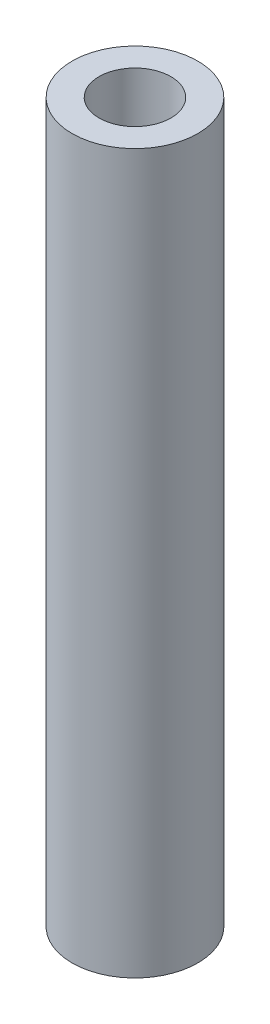
ISO-10303-21;
HEADER;
FILE_DESCRIPTION(('STEP AP214'),'2;1');
FILE_NAME('part.step','',(''),(''),'','','');
FILE_SCHEMA(('AUTOMOTIVE_DESIGN { 1 0 10303 214 1 1 1 1 }'));
ENDSEC;
DATA;
#1=APPLICATION_CONTEXT('core data for automotive mechanical design processes');
#2=APPLICATION_PROTOCOL_DEFINITION('international standard','automotive_design',2000,#1);
#3=PRODUCT_CONTEXT('',#1,'mechanical');
#4=PRODUCT('Part','Part','',(#3));
#5=PRODUCT_RELATED_PRODUCT_CATEGORY('part','',(#4));
#6=PRODUCT_DEFINITION_FORMATION('','',#4);
#7=PRODUCT_DEFINITION_CONTEXT('part definition',#1,'design');
#8=PRODUCT_DEFINITION('design','',#6,#7);
#9=PRODUCT_DEFINITION_SHAPE('','',#8);
#10=(LENGTH_UNIT() NAMED_UNIT(*) SI_UNIT(.MILLI.,.METRE.));
#11=(NAMED_UNIT(*) PLANE_ANGLE_UNIT() SI_UNIT($,.RADIAN.));
#12=(NAMED_UNIT(*) SI_UNIT($,.STERADIAN.) SOLID_ANGLE_UNIT());
#13=UNCERTAINTY_MEASURE_WITH_UNIT(LENGTH_MEASURE(1.E-05),#10,'distance_accuracy_value','');
#14=(GEOMETRIC_REPRESENTATION_CONTEXT(3) GLOBAL_UNCERTAINTY_ASSIGNED_CONTEXT((#13)) GLOBAL_UNIT_ASSIGNED_CONTEXT((#10,
#11,#12)) REPRESENTATION_CONTEXT('',''));
#15=CARTESIAN_POINT('',(0.,0.,0.));
#16=DIRECTION('',(0.,0.,1.));
#17=DIRECTION('',(1.,0.,0.));
#18=AXIS2_PLACEMENT_3D('',#15,#16,#17);
#19=CARTESIAN_POINT('',(0.,40.,0.));
#20=DIRECTION('',(0.,1.,0.));
#21=DIRECTION('',(0.,0.,1.));
#22=AXIS2_PLACEMENT_3D('',#19,#20,#21);
#23=PLANE('',#22);
#24=CARTESIAN_POINT('',(0.,40.,0.));
#25=DIRECTION('',(0.,1.,0.));
#26=DIRECTION('',(0.,0.,1.));
#27=AXIS2_PLACEMENT_3D('',#24,#25,#26);
#28=CIRCLE('',#27,3.5);
#29=CARTESIAN_POINT('',(0.,40.,3.5));
#30=VERTEX_POINT('',#29);
#31=EDGE_CURVE('E10',#30,#30,#28,.T.);
#32=ORIENTED_EDGE('',*,*,#31,.T.);
#33=EDGE_LOOP('',(#32));
#34=FACE_BOUND('',#33,.T.);
#35=CARTESIAN_POINT('',(0.,40.,0.));
#36=DIRECTION('',(0.,1.,0.));
#37=DIRECTION('',(0.,0.,1.));
#38=AXIS2_PLACEMENT_3D('',#35,#36,#37);
#39=CIRCLE('',#38,2.);
#40=CARTESIAN_POINT('',(0.,40.,2.));
#41=VERTEX_POINT('',#40);
#42=EDGE_CURVE('E50',#41,#41,#39,.T.);
#43=ORIENTED_EDGE('',*,*,#42,.F.);
#44=EDGE_LOOP('',(#43));
#45=FACE_BOUND('',#44,.T.);
#46=ADVANCED_FACE('F37',(#34,#45),#23,.T.);
#47=CARTESIAN_POINT('',(0.,0.,0.));
#48=DIRECTION('',(0.,1.,0.));
#49=DIRECTION('',(0.,0.,1.));
#50=AXIS2_PLACEMENT_3D('',#47,#48,#49);
#51=PLANE('',#50);
#52=CARTESIAN_POINT('',(0.,0.,0.));
#53=DIRECTION('',(0.,1.,0.));
#54=DIRECTION('',(0.,0.,1.));
#55=AXIS2_PLACEMENT_3D('',#52,#53,#54);
#56=CIRCLE('',#55,3.5);
#57=CARTESIAN_POINT('',(0.,0.,3.5));
#58=VERTEX_POINT('',#57);
#59=EDGE_CURVE('E41',#58,#58,#56,.T.);
#60=ORIENTED_EDGE('',*,*,#59,.F.);
#61=EDGE_LOOP('',(#60));
#62=FACE_BOUND('',#61,.T.);
#63=CARTESIAN_POINT('',(0.,0.,0.));
#64=DIRECTION('',(0.,1.,0.));
#65=DIRECTION('',(0.,0.,1.));
#66=AXIS2_PLACEMENT_3D('',#63,#64,#65);
#67=CIRCLE('',#66,2.);
#68=CARTESIAN_POINT('',(0.,0.,2.));
#69=VERTEX_POINT('',#68);
#70=EDGE_CURVE('E52',#69,#69,#67,.T.);
#71=ORIENTED_EDGE('',*,*,#70,.T.);
#72=EDGE_LOOP('',(#71));
#73=FACE_BOUND('',#72,.T.);
#74=ADVANCED_FACE('F64',(#62,#73),#51,.F.);
#75=CARTESIAN_POINT('',(0.,40.,0.));
#76=DIRECTION('',(0.,-1.,0.));
#77=DIRECTION('',(0.,0.,-1.));
#78=AXIS2_PLACEMENT_3D('',#75,#76,#77);
#79=CYLINDRICAL_SURFACE('',#78,3.5);
#80=ORIENTED_EDGE('',*,*,#31,.F.);
#81=EDGE_LOOP('',(#80));
#82=FACE_BOUND('',#81,.T.);
#83=ORIENTED_EDGE('',*,*,#59,.T.);
#84=EDGE_LOOP('',(#83));
#85=FACE_BOUND('',#84,.T.);
#86=ADVANCED_FACE('F39',(#82,#85),#79,.T.);
#87=CARTESIAN_POINT('',(0.,40.,0.));
#88=DIRECTION('',(0.,-1.,0.));
#89=DIRECTION('',(0.,0.,-1.));
#90=AXIS2_PLACEMENT_3D('',#87,#88,#89);
#91=CYLINDRICAL_SURFACE('',#90,2.);
#92=ORIENTED_EDGE('',*,*,#42,.T.);
#93=EDGE_LOOP('',(#92));
#94=FACE_BOUND('',#93,.T.);
#95=ORIENTED_EDGE('',*,*,#70,.F.);
#96=EDGE_LOOP('',(#95));
#97=FACE_BOUND('',#96,.T.);
#98=ADVANCED_FACE('F60',(#94,#97),#91,.F.);
#99=CLOSED_SHELL('',(#46,#74,#86,#98));
#100=MANIFOLD_SOLID_BREP('B2',#99);
#101=ADVANCED_BREP_SHAPE_REPRESENTATION('',(#18,#100),#14);
#102=SHAPE_DEFINITION_REPRESENTATION(#9,#101);
ENDSEC;
END-ISO-10303-21;
